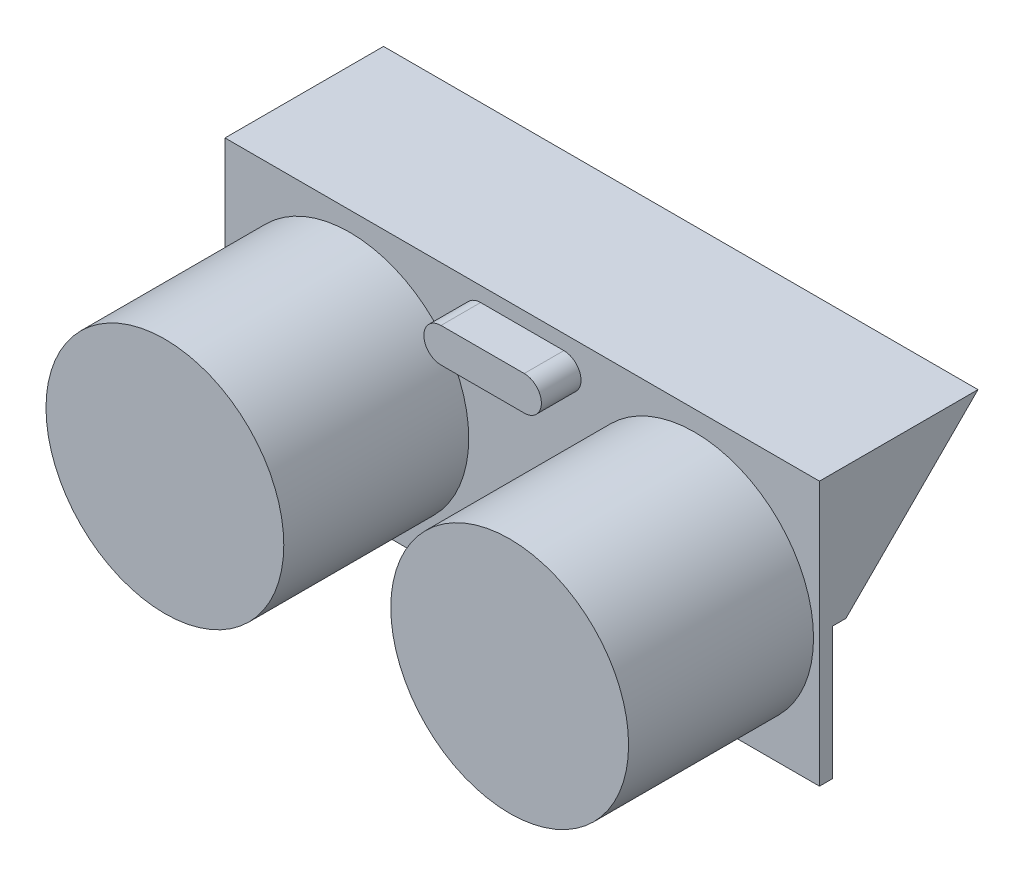
ISO-10303-21;
HEADER;
FILE_DESCRIPTION(('STEP AP214'),'2;1');
FILE_NAME('part.step','',(''),(''),'','','');
FILE_SCHEMA(('AUTOMOTIVE_DESIGN { 1 0 10303 214 1 1 1 1 }'));
ENDSEC;
DATA;
#1=APPLICATION_CONTEXT('core data for automotive mechanical design processes');
#2=APPLICATION_PROTOCOL_DEFINITION('international standard','automotive_design',2000,#1);
#3=PRODUCT_CONTEXT('',#1,'mechanical');
#4=PRODUCT('Part','Part','',(#3));
#5=PRODUCT_RELATED_PRODUCT_CATEGORY('part','',(#4));
#6=PRODUCT_DEFINITION_FORMATION('','',#4);
#7=PRODUCT_DEFINITION_CONTEXT('part definition',#1,'design');
#8=PRODUCT_DEFINITION('design','',#6,#7);
#9=PRODUCT_DEFINITION_SHAPE('','',#8);
#10=(LENGTH_UNIT() NAMED_UNIT(*) SI_UNIT(.MILLI.,.METRE.));
#11=(NAMED_UNIT(*) PLANE_ANGLE_UNIT() SI_UNIT($,.RADIAN.));
#12=(NAMED_UNIT(*) SI_UNIT($,.STERADIAN.) SOLID_ANGLE_UNIT());
#13=UNCERTAINTY_MEASURE_WITH_UNIT(LENGTH_MEASURE(1.E-05),#10,'distance_accuracy_value','');
#14=(GEOMETRIC_REPRESENTATION_CONTEXT(3) GLOBAL_UNCERTAINTY_ASSIGNED_CONTEXT((#13)) GLOBAL_UNIT_ASSIGNED_CONTEXT((#10,
#11,#12)) REPRESENTATION_CONTEXT('',''));
#15=CARTESIAN_POINT('',(0.,0.,0.));
#16=DIRECTION('',(0.,0.,1.));
#17=DIRECTION('',(1.,0.,0.));
#18=AXIS2_PLACEMENT_3D('',#15,#16,#17);
#19=CARTESIAN_POINT('',(0.,0.,1.));
#20=DIRECTION('',(0.,0.,-1.));
#21=DIRECTION('',(-1.,0.,0.));
#22=AXIS2_PLACEMENT_3D('',#19,#20,#21);
#23=PLANE('',#22);
#24=DIRECTION('',(-1.,0.,0.));
#25=VECTOR('',#24,1.);
#26=CARTESIAN_POINT('',(0.,-0.783795282059243,1.));
#27=LINE('',#26,#25);
#28=CARTESIAN_POINT('',(-1.62653448607692,-0.783795282059243,1.));
#29=VERTEX_POINT('',#28);
#30=CARTESIAN_POINT('',(-7.92804271200497,-0.783795282059243,1.));
#31=VERTEX_POINT('',#30);
#32=EDGE_CURVE('E259',#29,#31,#27,.T.);
#33=ORIENTED_EDGE('',*,*,#32,.F.);
#34=CARTESIAN_POINT('',(-1.62653448607692,-2.08018867924529,1.));
#35=DIRECTION('',(0.,0.,-1.));
#36=DIRECTION('',(-1.,0.,0.));
#37=AXIS2_PLACEMENT_3D('',#34,#35,#36);
#38=CIRCLE('',#37,1.29639339718604);
#39=CARTESIAN_POINT('',(-1.62653448607692,-3.37658207643133,1.));
#40=VERTEX_POINT('',#39);
#41=EDGE_CURVE('E262',#29,#40,#38,.T.);
#42=ORIENTED_EDGE('',*,*,#41,.T.);
#43=DIRECTION('',(-1.,0.,0.));
#44=VECTOR('',#43,1.);
#45=CARTESIAN_POINT('',(0.,-3.37658207643133,1.));
#46=LINE('',#45,#44);
#47=CARTESIAN_POINT('',(-7.92804271200497,-3.37658207643133,1.));
#48=VERTEX_POINT('',#47);
#49=EDGE_CURVE('E236',#40,#48,#46,.T.);
#50=ORIENTED_EDGE('',*,*,#49,.T.);
#51=CARTESIAN_POINT('',(-7.92804271200497,-2.08018867924529,1.));
#52=DIRECTION('',(0.,0.,-1.));
#53=DIRECTION('',(-1.,0.,0.));
#54=AXIS2_PLACEMENT_3D('',#51,#52,#53);
#55=CIRCLE('',#54,1.29639339718604);
#56=EDGE_CURVE('E251',#48,#31,#55,.T.);
#57=ORIENTED_EDGE('',*,*,#56,.T.);
#58=EDGE_LOOP('',(#33,#42,#50,#57));
#59=FACE_BOUND('',#58,.T.);
#60=DIRECTION('',(-1.,0.,0.));
#61=VECTOR('',#60,1.);
#62=CARTESIAN_POINT('',(17.721957287995,15.9198113207547,1.));
#63=LINE('',#62,#61);
#64=CARTESIAN_POINT('',(17.721957287995,15.9198113207547,1.));
#65=VERTEX_POINT('',#64);
#66=CARTESIAN_POINT('',(-27.278042712005,15.9198113207547,1.));
#67=VERTEX_POINT('',#66);
#68=EDGE_CURVE('E321',#65,#67,#63,.T.);
#69=ORIENTED_EDGE('',*,*,#68,.T.);
#70=DIRECTION('',(0.,1.,0.));
#71=VECTOR('',#70,1.);
#72=CARTESIAN_POINT('',(-27.278042712005,-4.08018867924529,1.));
#73=LINE('',#72,#71);
#74=CARTESIAN_POINT('',(-27.278042712005,-4.08018867924529,1.));
#75=VERTEX_POINT('',#74);
#76=EDGE_CURVE('E330',#75,#67,#73,.T.);
#77=ORIENTED_EDGE('',*,*,#76,.F.);
#78=DIRECTION('',(-1.,0.,0.));
#79=VECTOR('',#78,1.);
#80=CARTESIAN_POINT('',(17.721957287995,-4.08018867924529,1.));
#81=LINE('',#80,#79);
#82=CARTESIAN_POINT('',(17.721957287995,-4.08018867924529,1.));
#83=VERTEX_POINT('',#82);
#84=EDGE_CURVE('E335',#83,#75,#81,.T.);
#85=ORIENTED_EDGE('',*,*,#84,.F.);
#86=DIRECTION('',(0.,1.,0.));
#87=VECTOR('',#86,1.);
#88=CARTESIAN_POINT('',(17.721957287995,-4.08018867924529,1.));
#89=LINE('',#88,#87);
#90=EDGE_CURVE('E337',#83,#65,#89,.T.);
#91=ORIENTED_EDGE('',*,*,#90,.T.);
#92=EDGE_LOOP('',(#69,#77,#85,#91));
#93=FACE_BOUND('',#92,.T.);
#94=CARTESIAN_POINT('',(-17.828042712005,5.45646512767177,1.));
#95=DIRECTION('',(0.,0.,1.));
#96=DIRECTION('',(1.,0.,0.));
#97=AXIS2_PLACEMENT_3D('',#94,#95,#96);
#98=CIRCLE('',#97,9.);
#99=CARTESIAN_POINT('',(-8.82804271200498,5.45646512767177,1.));
#100=VERTEX_POINT('',#99);
#101=EDGE_CURVE('E317',#100,#100,#98,.T.);
#102=ORIENTED_EDGE('',*,*,#101,.F.);
#103=EDGE_LOOP('',(#102));
#104=FACE_BOUND('',#103,.T.);
#105=CARTESIAN_POINT('',(8.27195728799502,5.41013050836347,1.));
#106=DIRECTION('',(0.,0.,1.));
#107=DIRECTION('',(1.,0.,0.));
#108=AXIS2_PLACEMENT_3D('',#105,#106,#107);
#109=CIRCLE('',#108,9.);
#110=CARTESIAN_POINT('',(17.271957287995,5.41013050836347,1.));
#111=VERTEX_POINT('',#110);
#112=EDGE_CURVE('E311',#111,#111,#109,.T.);
#113=ORIENTED_EDGE('',*,*,#112,.F.);
#114=EDGE_LOOP('',(#113));
#115=FACE_BOUND('',#114,.T.);
#116=CARTESIAN_POINT('',(-7.92879682496901,13.5051058192453,1.));
#117=DIRECTION('',(0.,0.,1.));
#118=DIRECTION('',(1.,0.,0.));
#119=AXIS2_PLACEMENT_3D('',#116,#117,#118);
#120=CIRCLE('',#119,1.29736934063224);
#121=CARTESIAN_POINT('',(-7.92879682496901,14.8024751598776,1.));
#122=VERTEX_POINT('',#121);
#123=CARTESIAN_POINT('',(-7.92879682496901,12.2077364786131,1.));
#124=VERTEX_POINT('',#123);
#125=EDGE_CURVE('E261',#122,#124,#120,.T.);
#126=ORIENTED_EDGE('',*,*,#125,.F.);
#127=DIRECTION('',(1.,0.,0.));
#128=VECTOR('',#127,1.);
#129=CARTESIAN_POINT('',(-7.92879682496901,14.8024751598776,1.));
#130=LINE('',#129,#128);
#131=CARTESIAN_POINT('',(-1.62728859904095,14.8024751598776,1.));
#132=VERTEX_POINT('',#131);
#133=EDGE_CURVE('E272',#122,#132,#130,.T.);
#134=ORIENTED_EDGE('',*,*,#133,.T.);
#135=CARTESIAN_POINT('',(-1.62728859904095,13.5051058192453,1.));
#136=DIRECTION('',(0.,0.,1.));
#137=DIRECTION('',(1.,0.,0.));
#138=AXIS2_PLACEMENT_3D('',#135,#136,#137);
#139=CIRCLE('',#138,1.29736934063224);
#140=CARTESIAN_POINT('',(-1.62728859904095,12.2077364786131,1.));
#141=VERTEX_POINT('',#140);
#142=EDGE_CURVE('E288',#141,#132,#139,.T.);
#143=ORIENTED_EDGE('',*,*,#142,.F.);
#144=DIRECTION('',(1.,0.,0.));
#145=VECTOR('',#144,1.);
#146=CARTESIAN_POINT('',(-7.92879682496901,12.2077364786131,1.));
#147=LINE('',#146,#145);
#148=EDGE_CURVE('E281',#124,#141,#147,.T.);
#149=ORIENTED_EDGE('',*,*,#148,.F.);
#150=EDGE_LOOP('',(#126,#134,#143,#149));
#151=FACE_BOUND('',#150,.T.);
#152=ADVANCED_FACE('F44',(#59,#93,#104,#115,#151),#23,.F.);
#153=CARTESIAN_POINT('',(17.721957287995,15.9198113207547,1.));
#154=DIRECTION('',(0.,-1.,0.));
#155=DIRECTION('',(0.,0.,-1.));
#156=AXIS2_PLACEMENT_3D('',#153,#154,#155);
#157=PLANE('',#156);
#158=DIRECTION('',(0.,0.,-1.));
#159=VECTOR('',#158,1.);
#160=CARTESIAN_POINT('',(17.721957287995,15.9198113207547,1.));
#161=LINE('',#160,#159);
#162=CARTESIAN_POINT('',(17.721957287995,15.9198113207547,-10.9999999999998));
#163=VERTEX_POINT('',#162);
#164=EDGE_CURVE('E336',#65,#163,#161,.T.);
#165=ORIENTED_EDGE('',*,*,#164,.T.);
#166=DIRECTION('',(-1.,0.,0.));
#167=VECTOR('',#166,1.);
#168=CARTESIAN_POINT('',(0.,15.9198113207547,-10.9999999999998));
#169=LINE('',#168,#167);
#170=CARTESIAN_POINT('',(-27.278042712005,15.9198113207547,-10.9999999999998));
#171=VERTEX_POINT('',#170);
#172=EDGE_CURVE('E367',#163,#171,#169,.T.);
#173=ORIENTED_EDGE('',*,*,#172,.T.);
#174=DIRECTION('',(0.,0.,-1.));
#175=VECTOR('',#174,1.);
#176=CARTESIAN_POINT('',(-27.278042712005,15.9198113207547,1.));
#177=LINE('',#176,#175);
#178=EDGE_CURVE('E318',#67,#171,#177,.T.);
#179=ORIENTED_EDGE('',*,*,#178,.F.);
#180=ORIENTED_EDGE('',*,*,#68,.F.);
#181=EDGE_LOOP('',(#165,#173,#179,#180));
#182=FACE_BOUND('',#181,.T.);
#183=ADVANCED_FACE('F389',(#182),#157,.F.);
#184=CARTESIAN_POINT('',(-27.278042712005,-4.08018867924529,1.));
#185=DIRECTION('',(-1.,0.,0.));
#186=DIRECTION('',(0.,-1.,0.));
#187=AXIS2_PLACEMENT_3D('',#184,#185,#186);
#188=PLANE('',#187);
#189=ORIENTED_EDGE('',*,*,#178,.T.);
#190=DIRECTION('',(0.,-0.707106781186551,0.707106781186544));
#191=VECTOR('',#190,1.);
#192=CARTESIAN_POINT('',(-27.278042712005,-0.0801886792453051,5.00000000000003));
#193=LINE('',#192,#191);
#194=CARTESIAN_POINT('',(-27.278042712005,5.91981132075471,-0.999999999999925));
#195=VERTEX_POINT('',#194);
#196=EDGE_CURVE('E68',#171,#195,#193,.T.);
#197=ORIENTED_EDGE('',*,*,#196,.T.);
#198=DIRECTION('',(0.,0.,1.));
#199=VECTOR('',#198,1.);
#200=CARTESIAN_POINT('',(-27.278042712005,5.91981132075471,-12.));
#201=LINE('',#200,#199);
#202=CARTESIAN_POINT('',(-27.278042712005,5.91981132075471,0.));
#203=VERTEX_POINT('',#202);
#204=EDGE_CURVE('E167',#195,#203,#201,.T.);
#205=ORIENTED_EDGE('',*,*,#204,.T.);
#206=DIRECTION('',(0.,1.,0.));
#207=VECTOR('',#206,1.);
#208=CARTESIAN_POINT('',(-27.278042712005,-4.08018867924529,0.));
#209=LINE('',#208,#207);
#210=CARTESIAN_POINT('',(-27.278042712005,-4.08018867924529,0.));
#211=VERTEX_POINT('',#210);
#212=EDGE_CURVE('E173',#211,#203,#209,.T.);
#213=ORIENTED_EDGE('',*,*,#212,.F.);
#214=DIRECTION('',(0.,0.,-1.));
#215=VECTOR('',#214,1.);
#216=CARTESIAN_POINT('',(-27.278042712005,-4.08018867924529,1.));
#217=LINE('',#216,#215);
#218=EDGE_CURVE('E346',#75,#211,#217,.T.);
#219=ORIENTED_EDGE('',*,*,#218,.F.);
#220=ORIENTED_EDGE('',*,*,#76,.T.);
#221=EDGE_LOOP('',(#189,#197,#205,#213,#219,#220));
#222=FACE_BOUND('',#221,.T.);
#223=ADVANCED_FACE('F175',(#222),#188,.T.);
#224=CARTESIAN_POINT('',(17.721957287995,-4.08018867924529,1.));
#225=DIRECTION('',(0.,-1.,0.));
#226=DIRECTION('',(1.,0.,0.));
#227=AXIS2_PLACEMENT_3D('',#224,#225,#226);
#228=PLANE('',#227);
#229=DIRECTION('',(-1.,0.,0.));
#230=VECTOR('',#229,1.);
#231=CARTESIAN_POINT('',(17.721957287995,-4.08018867924529,0.));
#232=LINE('',#231,#230);
#233=CARTESIAN_POINT('',(17.721957287995,-4.08018867924529,0.));
#234=VERTEX_POINT('',#233);
#235=EDGE_CURVE('E189',#234,#211,#232,.T.);
#236=ORIENTED_EDGE('',*,*,#235,.F.);
#237=DIRECTION('',(0.,0.,-1.));
#238=VECTOR('',#237,1.);
#239=CARTESIAN_POINT('',(17.721957287995,-4.08018867924529,1.));
#240=LINE('',#239,#238);
#241=EDGE_CURVE('E350',#83,#234,#240,.T.);
#242=ORIENTED_EDGE('',*,*,#241,.F.);
#243=ORIENTED_EDGE('',*,*,#84,.T.);
#244=ORIENTED_EDGE('',*,*,#218,.T.);
#245=EDGE_LOOP('',(#236,#242,#243,#244));
#246=FACE_BOUND('',#245,.T.);
#247=ADVANCED_FACE('F379',(#246),#228,.T.);
#248=CARTESIAN_POINT('',(17.721957287995,-4.08018867924529,1.));
#249=DIRECTION('',(-1.,0.,0.));
#250=DIRECTION('',(0.,0.,1.));
#251=AXIS2_PLACEMENT_3D('',#248,#249,#250);
#252=PLANE('',#251);
#253=DIRECTION('',(0.,0.,1.));
#254=VECTOR('',#253,1.);
#255=CARTESIAN_POINT('',(17.721957287995,5.91981132075471,-12.));
#256=LINE('',#255,#254);
#257=CARTESIAN_POINT('',(17.721957287995,5.91981132075471,-0.999999999999925));
#258=VERTEX_POINT('',#257);
#259=CARTESIAN_POINT('',(17.721957287995,5.91981132075471,0.));
#260=VERTEX_POINT('',#259);
#261=EDGE_CURVE('E178',#258,#260,#256,.T.);
#262=ORIENTED_EDGE('',*,*,#261,.F.);
#263=DIRECTION('',(0.,0.707106781186551,-0.707106781186544));
#264=VECTOR('',#263,1.);
#265=CARTESIAN_POINT('',(17.721957287995,16.9198113207549,-12.));
#266=LINE('',#265,#264);
#267=EDGE_CURVE('E11',#258,#163,#266,.T.);
#268=ORIENTED_EDGE('',*,*,#267,.T.);
#269=ORIENTED_EDGE('',*,*,#164,.F.);
#270=ORIENTED_EDGE('',*,*,#90,.F.);
#271=ORIENTED_EDGE('',*,*,#241,.T.);
#272=DIRECTION('',(0.,1.,0.));
#273=VECTOR('',#272,1.);
#274=CARTESIAN_POINT('',(17.721957287995,-4.08018867924529,0.));
#275=LINE('',#274,#273);
#276=EDGE_CURVE('E328',#234,#260,#275,.T.);
#277=ORIENTED_EDGE('',*,*,#276,.T.);
#278=EDGE_LOOP('',(#262,#268,#269,#270,#271,#277));
#279=FACE_BOUND('',#278,.T.);
#280=ADVANCED_FACE('F376',(#279),#252,.F.);
#281=CARTESIAN_POINT('',(0.,0.,0.));
#282=DIRECTION('',(0.,0.,-1.));
#283=DIRECTION('',(-1.,0.,0.));
#284=AXIS2_PLACEMENT_3D('',#281,#282,#283);
#285=PLANE('',#284);
#286=DIRECTION('',(-1.,0.,0.));
#287=VECTOR('',#286,1.);
#288=CARTESIAN_POINT('',(17.721957287995,5.91981132075471,0.));
#289=LINE('',#288,#287);
#290=EDGE_CURVE('E177',#260,#203,#289,.T.);
#291=ORIENTED_EDGE('',*,*,#290,.F.);
#292=ORIENTED_EDGE('',*,*,#276,.F.);
#293=ORIENTED_EDGE('',*,*,#235,.T.);
#294=ORIENTED_EDGE('',*,*,#212,.T.);
#295=EDGE_LOOP('',(#291,#292,#293,#294));
#296=FACE_BOUND('',#295,.T.);
#297=CARTESIAN_POINT('',(-1.62653448607692,-2.08018867924529,0.));
#298=DIRECTION('',(0.,0.,-1.));
#299=DIRECTION('',(-1.,0.,0.));
#300=AXIS2_PLACEMENT_3D('',#297,#298,#299);
#301=CIRCLE('',#300,1.29639339718604);
#302=CARTESIAN_POINT('',(-1.62653448607692,-0.783795282059243,0.));
#303=VERTEX_POINT('',#302);
#304=CARTESIAN_POINT('',(-1.62653448607692,-3.37658207643133,0.));
#305=VERTEX_POINT('',#304);
#306=EDGE_CURVE('E362',#303,#305,#301,.T.);
#307=ORIENTED_EDGE('',*,*,#306,.F.);
#308=DIRECTION('',(-1.,0.,0.));
#309=VECTOR('',#308,1.);
#310=CARTESIAN_POINT('',(0.,-0.783795282059243,0.));
#311=LINE('',#310,#309);
#312=CARTESIAN_POINT('',(-7.92804271200497,-0.783795282059243,0.));
#313=VERTEX_POINT('',#312);
#314=EDGE_CURVE('E365',#303,#313,#311,.T.);
#315=ORIENTED_EDGE('',*,*,#314,.T.);
#316=CARTESIAN_POINT('',(-7.92804271200497,-2.08018867924529,0.));
#317=DIRECTION('',(0.,0.,-1.));
#318=DIRECTION('',(-1.,0.,0.));
#319=AXIS2_PLACEMENT_3D('',#316,#317,#318);
#320=CIRCLE('',#319,1.29639339718604);
#321=CARTESIAN_POINT('',(-7.92804271200497,-3.37658207643133,0.));
#322=VERTEX_POINT('',#321);
#323=EDGE_CURVE('E356',#322,#313,#320,.T.);
#324=ORIENTED_EDGE('',*,*,#323,.F.);
#325=DIRECTION('',(-1.,0.,0.));
#326=VECTOR('',#325,1.);
#327=CARTESIAN_POINT('',(0.,-3.37658207643133,0.));
#328=LINE('',#327,#326);
#329=EDGE_CURVE('E314',#305,#322,#328,.T.);
#330=ORIENTED_EDGE('',*,*,#329,.F.);
#331=EDGE_LOOP('',(#307,#315,#324,#330));
#332=FACE_BOUND('',#331,.T.);
#333=ADVANCED_FACE('F182',(#296,#332),#285,.T.);
#334=CARTESIAN_POINT('',(-17.828042712005,5.45646512767177,15.));
#335=DIRECTION('',(0.,0.,-1.));
#336=DIRECTION('',(-1.,0.,0.));
#337=AXIS2_PLACEMENT_3D('',#334,#335,#336);
#338=CYLINDRICAL_SURFACE('',#337,9.);
#339=CARTESIAN_POINT('',(-17.828042712005,5.45646512767177,15.));
#340=DIRECTION('',(0.,0.,1.));
#341=DIRECTION('',(1.,0.,0.));
#342=AXIS2_PLACEMENT_3D('',#339,#340,#341);
#343=CIRCLE('',#342,9.);
#344=CARTESIAN_POINT('',(-8.82804271200498,5.45646512767177,15.));
#345=VERTEX_POINT('',#344);
#346=EDGE_CURVE('E310',#345,#345,#343,.T.);
#347=ORIENTED_EDGE('',*,*,#346,.F.);
#348=EDGE_LOOP('',(#347));
#349=FACE_BOUND('',#348,.T.);
#350=ORIENTED_EDGE('',*,*,#101,.T.);
#351=EDGE_LOOP('',(#350));
#352=FACE_BOUND('',#351,.T.);
#353=ADVANCED_FACE('F408',(#349,#352),#338,.T.);
#354=CARTESIAN_POINT('',(-17.828042712005,5.45646512767177,15.));
#355=DIRECTION('',(0.,0.,1.));
#356=DIRECTION('',(1.,0.,0.));
#357=AXIS2_PLACEMENT_3D('',#354,#355,#356);
#358=PLANE('',#357);
#359=ORIENTED_EDGE('',*,*,#346,.T.);
#360=EDGE_LOOP('',(#359));
#361=FACE_BOUND('',#360,.T.);
#362=ADVANCED_FACE('F407',(#361),#358,.T.);
#363=CARTESIAN_POINT('',(8.27195728799502,5.41013050836347,15.));
#364=DIRECTION('',(0.,0.,-1.));
#365=DIRECTION('',(-1.,0.,0.));
#366=AXIS2_PLACEMENT_3D('',#363,#364,#365);
#367=CYLINDRICAL_SURFACE('',#366,9.);
#368=CARTESIAN_POINT('',(8.27195728799502,5.41013050836347,15.));
#369=DIRECTION('',(0.,0.,1.));
#370=DIRECTION('',(1.,0.,0.));
#371=AXIS2_PLACEMENT_3D('',#368,#369,#370);
#372=CIRCLE('',#371,9.);
#373=CARTESIAN_POINT('',(17.271957287995,5.41013050836347,15.));
#374=VERTEX_POINT('',#373);
#375=EDGE_CURVE('E188',#374,#374,#372,.T.);
#376=ORIENTED_EDGE('',*,*,#375,.F.);
#377=EDGE_LOOP('',(#376));
#378=FACE_BOUND('',#377,.T.);
#379=ORIENTED_EDGE('',*,*,#112,.T.);
#380=EDGE_LOOP('',(#379));
#381=FACE_BOUND('',#380,.T.);
#382=ADVANCED_FACE('F577',(#378,#381),#367,.T.);
#383=CARTESIAN_POINT('',(8.27195728799502,5.41013050836347,15.));
#384=DIRECTION('',(0.,0.,1.));
#385=DIRECTION('',(1.,0.,0.));
#386=AXIS2_PLACEMENT_3D('',#383,#384,#385);
#387=PLANE('',#386);
#388=ORIENTED_EDGE('',*,*,#375,.T.);
#389=EDGE_LOOP('',(#388));
#390=FACE_BOUND('',#389,.T.);
#391=ADVANCED_FACE('F565',(#390),#387,.T.);
#392=CARTESIAN_POINT('',(-7.92879682496901,13.5051058192453,4.));
#393=DIRECTION('',(0.,0.,-1.));
#394=DIRECTION('',(-1.,0.,0.));
#395=AXIS2_PLACEMENT_3D('',#392,#393,#394);
#396=CYLINDRICAL_SURFACE('',#395,1.29736934063224);
#397=ORIENTED_EDGE('',*,*,#125,.T.);
#398=DIRECTION('',(0.,0.,-1.));
#399=VECTOR('',#398,1.);
#400=CARTESIAN_POINT('',(-7.92879682496901,12.2077364786131,4.));
#401=LINE('',#400,#399);
#402=CARTESIAN_POINT('',(-7.92879682496901,12.2077364786131,4.));
#403=VERTEX_POINT('',#402);
#404=EDGE_CURVE('E302',#403,#124,#401,.T.);
#405=ORIENTED_EDGE('',*,*,#404,.F.);
#406=CARTESIAN_POINT('',(-7.92879682496901,13.5051058192453,4.));
#407=DIRECTION('',(0.,0.,1.));
#408=DIRECTION('',(1.,0.,0.));
#409=AXIS2_PLACEMENT_3D('',#406,#407,#408);
#410=CIRCLE('',#409,1.29736934063224);
#411=CARTESIAN_POINT('',(-7.92879682496901,14.8024751598776,4.));
#412=VERTEX_POINT('',#411);
#413=EDGE_CURVE('E267',#412,#403,#410,.T.);
#414=ORIENTED_EDGE('',*,*,#413,.F.);
#415=DIRECTION('',(0.,0.,-1.));
#416=VECTOR('',#415,1.);
#417=CARTESIAN_POINT('',(-7.92879682496901,14.8024751598776,4.));
#418=LINE('',#417,#416);
#419=EDGE_CURVE('E282',#412,#122,#418,.T.);
#420=ORIENTED_EDGE('',*,*,#419,.T.);
#421=EDGE_LOOP('',(#397,#405,#414,#420));
#422=FACE_BOUND('',#421,.T.);
#423=ADVANCED_FACE('F555',(#422),#396,.T.);
#424=CARTESIAN_POINT('',(-7.92879682496901,12.2077364786131,4.));
#425=DIRECTION('',(0.,1.,0.));
#426=DIRECTION('',(0.,0.,1.));
#427=AXIS2_PLACEMENT_3D('',#424,#425,#426);
#428=PLANE('',#427);
#429=ORIENTED_EDGE('',*,*,#148,.T.);
#430=DIRECTION('',(0.,0.,-1.));
#431=VECTOR('',#430,1.);
#432=CARTESIAN_POINT('',(-1.62728859904095,12.2077364786131,4.));
#433=LINE('',#432,#431);
#434=CARTESIAN_POINT('',(-1.62728859904095,12.2077364786131,4.));
#435=VERTEX_POINT('',#434);
#436=EDGE_CURVE('E297',#435,#141,#433,.T.);
#437=ORIENTED_EDGE('',*,*,#436,.F.);
#438=DIRECTION('',(1.,0.,0.));
#439=VECTOR('',#438,1.);
#440=CARTESIAN_POINT('',(-7.92879682496901,12.2077364786131,4.));
#441=LINE('',#440,#439);
#442=EDGE_CURVE('E266',#403,#435,#441,.T.);
#443=ORIENTED_EDGE('',*,*,#442,.F.);
#444=ORIENTED_EDGE('',*,*,#404,.T.);
#445=EDGE_LOOP('',(#429,#437,#443,#444));
#446=FACE_BOUND('',#445,.T.);
#447=ADVANCED_FACE('F541',(#446),#428,.F.);
#448=CARTESIAN_POINT('',(-1.62728859904095,13.5051058192453,4.));
#449=DIRECTION('',(0.,0.,-1.));
#450=DIRECTION('',(-1.,0.,0.));
#451=AXIS2_PLACEMENT_3D('',#448,#449,#450);
#452=CYLINDRICAL_SURFACE('',#451,1.29736934063224);
#453=ORIENTED_EDGE('',*,*,#142,.T.);
#454=DIRECTION('',(0.,0.,-1.));
#455=VECTOR('',#454,1.);
#456=CARTESIAN_POINT('',(-1.62728859904095,14.8024751598776,4.));
#457=LINE('',#456,#455);
#458=CARTESIAN_POINT('',(-1.62728859904095,14.8024751598776,4.));
#459=VERTEX_POINT('',#458);
#460=EDGE_CURVE('E298',#459,#132,#457,.T.);
#461=ORIENTED_EDGE('',*,*,#460,.F.);
#462=CARTESIAN_POINT('',(-1.62728859904095,13.5051058192453,4.));
#463=DIRECTION('',(0.,0.,1.));
#464=DIRECTION('',(1.,0.,0.));
#465=AXIS2_PLACEMENT_3D('',#462,#463,#464);
#466=CIRCLE('',#465,1.29736934063224);
#467=EDGE_CURVE('E274',#435,#459,#466,.T.);
#468=ORIENTED_EDGE('',*,*,#467,.F.);
#469=ORIENTED_EDGE('',*,*,#436,.T.);
#470=EDGE_LOOP('',(#453,#461,#468,#469));
#471=FACE_BOUND('',#470,.T.);
#472=ADVANCED_FACE('F537',(#471),#452,.T.);
#473=CARTESIAN_POINT('',(-7.92879682496901,14.8024751598776,4.));
#474=DIRECTION('',(0.,1.,0.));
#475=DIRECTION('',(0.,0.,1.));
#476=AXIS2_PLACEMENT_3D('',#473,#474,#475);
#477=PLANE('',#476);
#478=ORIENTED_EDGE('',*,*,#133,.F.);
#479=ORIENTED_EDGE('',*,*,#419,.F.);
#480=DIRECTION('',(1.,0.,0.));
#481=VECTOR('',#480,1.);
#482=CARTESIAN_POINT('',(-7.92879682496901,14.8024751598776,4.));
#483=LINE('',#482,#481);
#484=EDGE_CURVE('E280',#412,#459,#483,.T.);
#485=ORIENTED_EDGE('',*,*,#484,.T.);
#486=ORIENTED_EDGE('',*,*,#460,.T.);
#487=EDGE_LOOP('',(#478,#479,#485,#486));
#488=FACE_BOUND('',#487,.T.);
#489=ADVANCED_FACE('F530',(#488),#477,.T.);
#490=CARTESIAN_POINT('',(-7.92879682496901,13.5051058192453,4.));
#491=DIRECTION('',(0.,0.,1.));
#492=DIRECTION('',(1.,0.,0.));
#493=AXIS2_PLACEMENT_3D('',#490,#491,#492);
#494=PLANE('',#493);
#495=ORIENTED_EDGE('',*,*,#413,.T.);
#496=ORIENTED_EDGE('',*,*,#442,.T.);
#497=ORIENTED_EDGE('',*,*,#467,.T.);
#498=ORIENTED_EDGE('',*,*,#484,.F.);
#499=EDGE_LOOP('',(#495,#496,#497,#498));
#500=FACE_BOUND('',#499,.T.);
#501=ADVANCED_FACE('F516',(#500),#494,.T.);
#502=CARTESIAN_POINT('',(-1.62653448607692,-2.08018867924529,-6.));
#503=DIRECTION('',(0.,0.,-1.));
#504=DIRECTION('',(-1.,0.,0.));
#505=AXIS2_PLACEMENT_3D('',#502,#503,#504);
#506=PLANE('',#505);
#507=CARTESIAN_POINT('',(-1.62653448607692,-2.08018867924529,-6.));
#508=DIRECTION('',(0.,0.,-1.));
#509=DIRECTION('',(-1.,0.,0.));
#510=AXIS2_PLACEMENT_3D('',#507,#508,#509);
#511=CIRCLE('',#510,1.29639339718604);
#512=CARTESIAN_POINT('',(-1.62653448607692,-0.783795282059243,-6.));
#513=VERTEX_POINT('',#512);
#514=CARTESIAN_POINT('',(-1.62653448607692,-3.37658207643133,-6.));
#515=VERTEX_POINT('',#514);
#516=EDGE_CURVE('E196',#513,#515,#511,.T.);
#517=ORIENTED_EDGE('',*,*,#516,.T.);
#518=DIRECTION('',(-1.,0.,0.));
#519=VECTOR('',#518,1.);
#520=CARTESIAN_POINT('',(-1.62653448607692,-3.37658207643133,-6.));
#521=LINE('',#520,#519);
#522=CARTESIAN_POINT('',(-7.92804271200497,-3.37658207643133,-6.));
#523=VERTEX_POINT('',#522);
#524=EDGE_CURVE('E204',#515,#523,#521,.T.);
#525=ORIENTED_EDGE('',*,*,#524,.T.);
#526=CARTESIAN_POINT('',(-7.92804271200497,-2.08018867924529,-6.));
#527=DIRECTION('',(0.,0.,-1.));
#528=DIRECTION('',(-1.,0.,0.));
#529=AXIS2_PLACEMENT_3D('',#526,#527,#528);
#530=CIRCLE('',#529,1.29639339718604);
#531=CARTESIAN_POINT('',(-7.92804271200497,-0.783795282059243,-6.));
#532=VERTEX_POINT('',#531);
#533=EDGE_CURVE('E206',#523,#532,#530,.T.);
#534=ORIENTED_EDGE('',*,*,#533,.T.);
#535=DIRECTION('',(-1.,0.,0.));
#536=VECTOR('',#535,1.);
#537=CARTESIAN_POINT('',(-1.62653448607692,-0.783795282059243,-6.));
#538=LINE('',#537,#536);
#539=EDGE_CURVE('E215',#513,#532,#538,.T.);
#540=ORIENTED_EDGE('',*,*,#539,.F.);
#541=EDGE_LOOP('',(#517,#525,#534,#540));
#542=FACE_BOUND('',#541,.T.);
#543=ADVANCED_FACE('F515',(#542),#506,.T.);
#544=CARTESIAN_POINT('',(-1.62653448607692,-3.37658207643133,1.5));
#545=DIRECTION('',(0.,-1.,0.));
#546=DIRECTION('',(0.,0.,-1.));
#547=AXIS2_PLACEMENT_3D('',#544,#545,#546);
#548=PLANE('',#547);
#549=DIRECTION('',(0.,0.,-1.));
#550=VECTOR('',#549,1.);
#551=CARTESIAN_POINT('',(-1.62653448607692,-3.37658207643133,1.5));
#552=LINE('',#551,#550);
#553=EDGE_CURVE('E233',#305,#515,#552,.T.);
#554=ORIENTED_EDGE('',*,*,#553,.F.);
#555=ORIENTED_EDGE('',*,*,#329,.T.);
#556=DIRECTION('',(0.,0.,-1.));
#557=VECTOR('',#556,1.);
#558=CARTESIAN_POINT('',(-7.92804271200497,-3.37658207643133,1.5));
#559=LINE('',#558,#557);
#560=EDGE_CURVE('E246',#322,#523,#559,.T.);
#561=ORIENTED_EDGE('',*,*,#560,.T.);
#562=ORIENTED_EDGE('',*,*,#524,.F.);
#563=EDGE_LOOP('',(#554,#555,#561,#562));
#564=FACE_BOUND('',#563,.T.);
#565=ADVANCED_FACE('F453',(#564),#548,.T.);
#566=CARTESIAN_POINT('',(-7.92804271200497,-2.08018867924529,1.5));
#567=DIRECTION('',(0.,0.,-1.));
#568=DIRECTION('',(-1.,0.,0.));
#569=AXIS2_PLACEMENT_3D('',#566,#567,#568);
#570=CYLINDRICAL_SURFACE('',#569,1.29639339718604);
#571=ORIENTED_EDGE('',*,*,#560,.F.);
#572=ORIENTED_EDGE('',*,*,#323,.T.);
#573=DIRECTION('',(0.,0.,-1.));
#574=VECTOR('',#573,1.);
#575=CARTESIAN_POINT('',(-7.92804271200497,-0.783795282059243,1.5));
#576=LINE('',#575,#574);
#577=EDGE_CURVE('E245',#313,#532,#576,.T.);
#578=ORIENTED_EDGE('',*,*,#577,.T.);
#579=ORIENTED_EDGE('',*,*,#533,.F.);
#580=EDGE_LOOP('',(#571,#572,#578,#579));
#581=FACE_BOUND('',#580,.T.);
#582=ADVANCED_FACE('F461',(#581),#570,.T.);
#583=CARTESIAN_POINT('',(-1.62653448607692,-0.783795282059243,1.5));
#584=DIRECTION('',(0.,-1.,0.));
#585=DIRECTION('',(0.,0.,-1.));
#586=AXIS2_PLACEMENT_3D('',#583,#584,#585);
#587=PLANE('',#586);
#588=ORIENTED_EDGE('',*,*,#314,.F.);
#589=DIRECTION('',(0.,0.,-1.));
#590=VECTOR('',#589,1.);
#591=CARTESIAN_POINT('',(-1.62653448607692,-0.783795282059243,1.5));
#592=LINE('',#591,#590);
#593=EDGE_CURVE('E240',#303,#513,#592,.T.);
#594=ORIENTED_EDGE('',*,*,#593,.T.);
#595=ORIENTED_EDGE('',*,*,#539,.T.);
#596=ORIENTED_EDGE('',*,*,#577,.F.);
#597=EDGE_LOOP('',(#588,#594,#595,#596));
#598=FACE_BOUND('',#597,.T.);
#599=ADVANCED_FACE('F473',(#598),#587,.F.);
#600=CARTESIAN_POINT('',(-1.62653448607692,-2.08018867924529,1.5));
#601=DIRECTION('',(0.,0.,-1.));
#602=DIRECTION('',(-1.,0.,0.));
#603=AXIS2_PLACEMENT_3D('',#600,#601,#602);
#604=CYLINDRICAL_SURFACE('',#603,1.29639339718604);
#605=ORIENTED_EDGE('',*,*,#593,.F.);
#606=ORIENTED_EDGE('',*,*,#306,.T.);
#607=ORIENTED_EDGE('',*,*,#553,.T.);
#608=ORIENTED_EDGE('',*,*,#516,.F.);
#609=EDGE_LOOP('',(#605,#606,#607,#608));
#610=FACE_BOUND('',#609,.T.);
#611=ADVANCED_FACE('F485',(#610),#604,.T.);
#612=ORIENTED_EDGE('',*,*,#41,.F.);
#613=CARTESIAN_POINT('',(-1.62653448607692,-0.783795282059243,1.5));
#614=VERTEX_POINT('',#613);
#615=EDGE_CURVE('E235',#614,#29,#592,.T.);
#616=ORIENTED_EDGE('',*,*,#615,.F.);
#617=CARTESIAN_POINT('',(-1.62653448607692,-2.08018867924529,1.5));
#618=DIRECTION('',(0.,0.,-1.));
#619=DIRECTION('',(-1.,0.,0.));
#620=AXIS2_PLACEMENT_3D('',#617,#618,#619);
#621=CIRCLE('',#620,1.29639339718604);
#622=CARTESIAN_POINT('',(-1.62653448607692,-3.37658207643133,1.5));
#623=VERTEX_POINT('',#622);
#624=EDGE_CURVE('E217',#614,#623,#621,.T.);
#625=ORIENTED_EDGE('',*,*,#624,.T.);
#626=EDGE_CURVE('E250',#623,#40,#552,.T.);
#627=ORIENTED_EDGE('',*,*,#626,.T.);
#628=EDGE_LOOP('',(#612,#616,#625,#627));
#629=FACE_BOUND('',#628,.T.);
#630=ADVANCED_FACE('F475',(#629),#604,.T.);
#631=ORIENTED_EDGE('',*,*,#615,.T.);
#632=ORIENTED_EDGE('',*,*,#32,.T.);
#633=CARTESIAN_POINT('',(-7.92804271200497,-0.783795282059243,1.5));
#634=VERTEX_POINT('',#633);
#635=EDGE_CURVE('E238',#634,#31,#576,.T.);
#636=ORIENTED_EDGE('',*,*,#635,.F.);
#637=DIRECTION('',(-1.,0.,0.));
#638=VECTOR('',#637,1.);
#639=CARTESIAN_POINT('',(-1.62653448607692,-0.783795282059243,1.5));
#640=LINE('',#639,#638);
#641=EDGE_CURVE('E226',#614,#634,#640,.T.);
#642=ORIENTED_EDGE('',*,*,#641,.F.);
#643=EDGE_LOOP('',(#631,#632,#636,#642));
#644=FACE_BOUND('',#643,.T.);
#645=ADVANCED_FACE('F465',(#644),#587,.F.);
#646=ORIENTED_EDGE('',*,*,#56,.F.);
#647=CARTESIAN_POINT('',(-7.92804271200497,-3.37658207643133,1.5));
#648=VERTEX_POINT('',#647);
#649=EDGE_CURVE('E243',#648,#48,#559,.T.);
#650=ORIENTED_EDGE('',*,*,#649,.F.);
#651=CARTESIAN_POINT('',(-7.92804271200497,-2.08018867924529,1.5));
#652=DIRECTION('',(0.,0.,-1.));
#653=DIRECTION('',(-1.,0.,0.));
#654=AXIS2_PLACEMENT_3D('',#651,#652,#653);
#655=CIRCLE('',#654,1.29639339718604);
#656=EDGE_CURVE('E224',#648,#634,#655,.T.);
#657=ORIENTED_EDGE('',*,*,#656,.T.);
#658=ORIENTED_EDGE('',*,*,#635,.T.);
#659=EDGE_LOOP('',(#646,#650,#657,#658));
#660=FACE_BOUND('',#659,.T.);
#661=ADVANCED_FACE('F455',(#660),#570,.T.);
#662=ORIENTED_EDGE('',*,*,#49,.F.);
#663=ORIENTED_EDGE('',*,*,#626,.F.);
#664=DIRECTION('',(-1.,0.,0.));
#665=VECTOR('',#664,1.);
#666=CARTESIAN_POINT('',(-1.62653448607692,-3.37658207643133,1.5));
#667=LINE('',#666,#665);
#668=EDGE_CURVE('E216',#623,#648,#667,.T.);
#669=ORIENTED_EDGE('',*,*,#668,.T.);
#670=ORIENTED_EDGE('',*,*,#649,.T.);
#671=EDGE_LOOP('',(#662,#663,#669,#670));
#672=FACE_BOUND('',#671,.T.);
#673=ADVANCED_FACE('F442',(#672),#548,.T.);
#674=CARTESIAN_POINT('',(-1.62653448607692,-2.08018867924529,1.5));
#675=DIRECTION('',(0.,0.,-1.));
#676=DIRECTION('',(-1.,0.,0.));
#677=AXIS2_PLACEMENT_3D('',#674,#675,#676);
#678=PLANE('',#677);
#679=ORIENTED_EDGE('',*,*,#624,.F.);
#680=ORIENTED_EDGE('',*,*,#641,.T.);
#681=ORIENTED_EDGE('',*,*,#656,.F.);
#682=ORIENTED_EDGE('',*,*,#668,.F.);
#683=EDGE_LOOP('',(#679,#680,#681,#682));
#684=FACE_BOUND('',#683,.T.);
#685=ADVANCED_FACE('F393',(#684),#678,.F.);
#686=CARTESIAN_POINT('',(17.721957287995,5.91981132075471,-12.));
#687=DIRECTION('',(0.,1.,0.));
#688=DIRECTION('',(0.,0.,1.));
#689=AXIS2_PLACEMENT_3D('',#686,#687,#688);
#690=PLANE('',#689);
#691=ORIENTED_EDGE('',*,*,#204,.F.);
#692=DIRECTION('',(1.,0.,0.));
#693=VECTOR('',#692,1.);
#694=CARTESIAN_POINT('',(17.721957287995,5.91981132075471,-0.999999999999925));
#695=LINE('',#694,#693);
#696=EDGE_CURVE('E54',#195,#258,#695,.T.);
#697=ORIENTED_EDGE('',*,*,#696,.T.);
#698=ORIENTED_EDGE('',*,*,#261,.T.);
#699=ORIENTED_EDGE('',*,*,#290,.T.);
#700=EDGE_LOOP('',(#691,#697,#698,#699));
#701=FACE_BOUND('',#700,.T.);
#702=ADVANCED_FACE('F195',(#701),#690,.F.);
#703=CARTESIAN_POINT('',(0.,16.9198113207549,-12.));
#704=DIRECTION('',(0.,-0.707106781186544,-0.707106781186551));
#705=DIRECTION('',(1.,0.,0.));
#706=AXIS2_PLACEMENT_3D('',#703,#704,#705);
#707=PLANE('',#706);
#708=ORIENTED_EDGE('',*,*,#267,.F.);
#709=ORIENTED_EDGE('',*,*,#696,.F.);
#710=ORIENTED_EDGE('',*,*,#196,.F.);
#711=ORIENTED_EDGE('',*,*,#172,.F.);
#712=EDGE_LOOP('',(#708,#709,#710,#711));
#713=FACE_BOUND('',#712,.T.);
#714=ADVANCED_FACE('F48',(#713),#707,.T.);
#715=CLOSED_SHELL('',(#152,#183,#223,#247,#280,#333,#353,#362,#382,#391,#423,#447,#472,#489,
#501,#543,#565,#582,#599,#611,#630,#645,#661,#673,#685,#702,#714));
#716=MANIFOLD_SOLID_BREP('B2',#715);
#717=ADVANCED_BREP_SHAPE_REPRESENTATION('',(#18,#716),#14);
#718=SHAPE_DEFINITION_REPRESENTATION(#9,#717);
ENDSEC;
END-ISO-10303-21;
